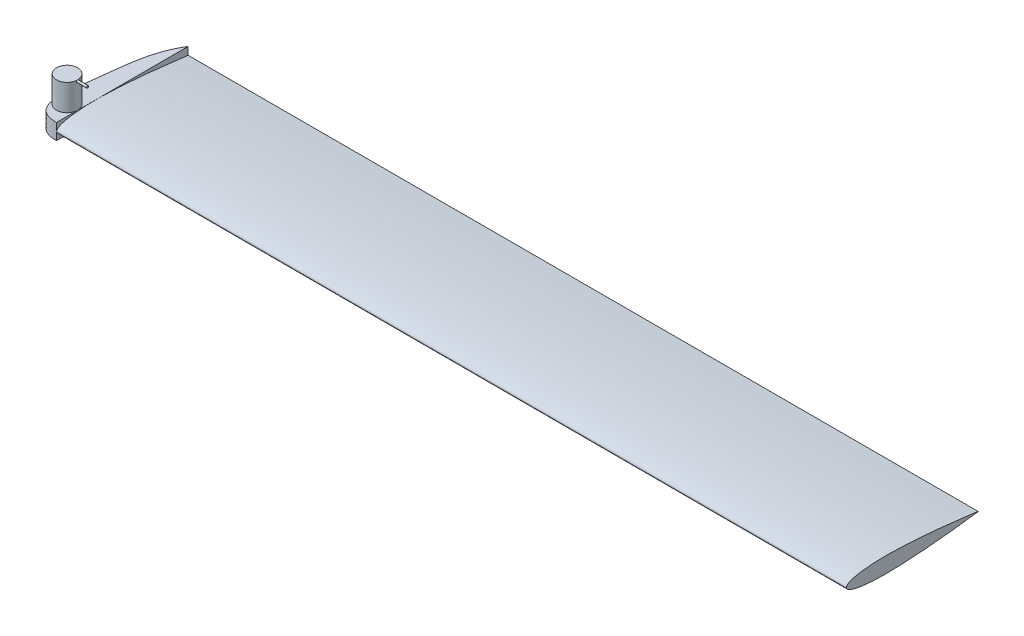
ISO-10303-21;
HEADER;
FILE_DESCRIPTION(('STEP AP214'),'2;1');
FILE_NAME('part.step','',(''),(''),'','','');
FILE_SCHEMA(('AUTOMOTIVE_DESIGN { 1 0 10303 214 1 1 1 1 }'));
ENDSEC;
DATA;
#1=APPLICATION_CONTEXT('core data for automotive mechanical design processes');
#2=APPLICATION_PROTOCOL_DEFINITION('international standard','automotive_design',2000,#1);
#3=PRODUCT_CONTEXT('',#1,'mechanical');
#4=PRODUCT('Part','Part','',(#3));
#5=PRODUCT_RELATED_PRODUCT_CATEGORY('part','',(#4));
#6=PRODUCT_DEFINITION_FORMATION('','',#4);
#7=PRODUCT_DEFINITION_CONTEXT('part definition',#1,'design');
#8=PRODUCT_DEFINITION('design','',#6,#7);
#9=PRODUCT_DEFINITION_SHAPE('','',#8);
#10=(LENGTH_UNIT() NAMED_UNIT(*) SI_UNIT(.MILLI.,.METRE.));
#11=(NAMED_UNIT(*) PLANE_ANGLE_UNIT() SI_UNIT($,.RADIAN.));
#12=(NAMED_UNIT(*) SI_UNIT($,.STERADIAN.) SOLID_ANGLE_UNIT());
#13=UNCERTAINTY_MEASURE_WITH_UNIT(LENGTH_MEASURE(1.E-05),#10,'distance_accuracy_value','');
#14=(GEOMETRIC_REPRESENTATION_CONTEXT(3) GLOBAL_UNCERTAINTY_ASSIGNED_CONTEXT((#13)) GLOBAL_UNIT_ASSIGNED_CONTEXT((#10,
#11,#12)) REPRESENTATION_CONTEXT('',''));
#15=CARTESIAN_POINT('',(0.,0.,0.));
#16=DIRECTION('',(0.,0.,1.));
#17=DIRECTION('',(1.,0.,0.));
#18=AXIS2_PLACEMENT_3D('',#15,#16,#17);
#19=CARTESIAN_POINT('',(-10.,40.,-20.));
#20=DIRECTION('',(0.,-1.,0.));
#21=DIRECTION('',(0.,0.,-1.));
#22=AXIS2_PLACEMENT_3D('',#19,#20,#21);
#23=CYLINDRICAL_SURFACE('',#22,10.);
#24=CARTESIAN_POINT('',(-10.,15.,-20.));
#25=DIRECTION('',(0.,1.,0.));
#26=DIRECTION('',(0.,0.,1.));
#27=AXIS2_PLACEMENT_3D('',#24,#25,#26);
#28=CIRCLE('',#27,10.);
#29=CARTESIAN_POINT('',(0.,15.,-20.));
#30=VERTEX_POINT('',#29);
#31=CARTESIAN_POINT('',(-20.,15.,-19.9998762848548));
#32=VERTEX_POINT('',#31);
#33=EDGE_CURVE('E118',#30,#32,#28,.T.);
#34=ORIENTED_EDGE('',*,*,#33,.T.);
#35=CARTESIAN_POINT('',(-19.9897549260361,15.,-19.5474555074506));
#36=CARTESIAN_POINT('',(-19.9960849752204,15.,-19.7723723018758));
#37=CARTESIAN_POINT('',(-20.,15.,-19.9998762848548));
#38=B_SPLINE_CURVE_WITH_KNOTS('',2,(#35,#36,#37),.UNSPECIFIED.,.F.,.F.,(3,3),(0.988813819343393,
1.),.UNSPECIFIED.);
#39=CARTESIAN_POINT('',(-19.9897549260361,15.,-19.5474555074504));
#40=VERTEX_POINT('',#39);
#41=EDGE_CURVE('E146',#40,#32,#38,.T.);
#42=ORIENTED_EDGE('',*,*,#41,.F.);
#43=EDGE_CURVE('E11',#40,#30,#28,.T.);
#44=ORIENTED_EDGE('',*,*,#43,.T.);
#45=EDGE_LOOP('',(#34,#42,#44));
#46=FACE_BOUND('',#45,.T.);
#47=CARTESIAN_POINT('',(-10.,40.,-20.));
#48=DIRECTION('',(0.,1.,0.));
#49=DIRECTION('',(0.,0.,1.));
#50=AXIS2_PLACEMENT_3D('',#47,#48,#49);
#51=CIRCLE('',#50,10.);
#52=CARTESIAN_POINT('',(1.13187796061662E-12,40.0000000000113,-19.9999999999987));
#53=VERTEX_POINT('',#52);
#54=EDGE_CURVE('E113',#53,#53,#51,.T.);
#55=ORIENTED_EDGE('',*,*,#54,.F.);
#56=CARTESIAN_POINT('',(-0.0501256289337938,39.,-21.));
#57=CARTESIAN_POINT('',(-0.0501249720309656,39.0560195641736,-20.9999975733935));
#58=CARTESIAN_POINT('',(-0.0496474300578126,39.1120761684118,-20.9952768589825));
#59=CARTESIAN_POINT('',(-0.0477891244188055,39.2226351862935,-20.9765163147636));
#60=CARTESIAN_POINT('',(-0.0464073653878035,39.2771358180375,-20.9624662148864));
#61=CARTESIAN_POINT('',(-0.0428986695261211,39.3829658192179,-20.9254601160689));
#62=CARTESIAN_POINT('',(-0.0407721845320974,39.4342970893914,-20.9025095162939));
#63=CARTESIAN_POINT('',(-0.0360141942817899,39.5323677922918,-20.8483642673911));
#64=CARTESIAN_POINT('',(-0.0333827893567047,39.5791081344837,-20.8171712556259));
#65=CARTESIAN_POINT('',(-0.0279007329010088,39.6668512636575,-20.7473047619987));
#66=CARTESIAN_POINT('',(-0.0250493999473345,39.7078350095038,-20.7086074181083));
#67=CARTESIAN_POINT('',(-0.0194549476428054,39.7827376090036,-20.6248817153196));
#68=CARTESIAN_POINT('',(-0.0167118332478645,39.8166561394063,-20.5798530669066));
#69=CARTESIAN_POINT('',(-0.0116361684439465,39.8765312570072,-20.484626361651));
#70=CARTESIAN_POINT('',(-0.00930449105352664,39.9024709987937,-20.4344176625296));
#71=CARTESIAN_POINT('',(-0.00532183124229081,39.9455444331487,-20.3303299842875));
#72=CARTESIAN_POINT('',(-0.00367083222935572,39.9626783403695,-20.2764510946682));
#73=CARTESIAN_POINT('',(-0.00124033428973593,39.9875979093533,-20.1667447827429));
#74=CARTESIAN_POINT('',(-0.000457921571828279,39.99541483275,-20.1109245270316));
#75=CARTESIAN_POINT('',(0.000157155986927986,40.0015752691337,-19.9987592593111));
#76=CARTESIAN_POINT('',(-1.0154547270365E-05,39.9999190277463,-19.9424142609455));
#77=CARTESIAN_POINT('',(-0.00127328688813979,39.9872055273498,-19.8310111559354));
#78=CARTESIAN_POINT('',(-0.00236578848286832,39.9761818844361,-19.775949170065));
#79=CARTESIAN_POINT('',(-0.00535270735069193,39.9450988710534,-19.6684608204955));
#80=CARTESIAN_POINT('',(-0.00724713504046194,39.9250393832124,-19.6160344910423));
#81=CARTESIAN_POINT('',(-0.0116306251608421,39.8764172367456,-19.5151996853204));
#82=CARTESIAN_POINT('',(-0.0141207263424196,39.8478397024698,-19.4667984290183));
#83=CARTESIAN_POINT('',(-0.0194161548059227,39.7830034766636,-19.3754664868258));
#84=CARTESIAN_POINT('',(-0.0222214913318851,39.7467445598548,-19.3325359614392));
#85=CARTESIAN_POINT('',(-0.0278470653214803,39.6673857704864,-19.2531672281773));
#86=CARTESIAN_POINT('',(-0.0306673142697202,39.6242566552584,-19.2167582538097));
#87=CARTESIAN_POINT('',(-0.0359926007177739,39.5324831347892,-19.1516924646421));
#88=CARTESIAN_POINT('',(-0.0384976377603528,39.4838387215479,-19.1230356610871));
#89=CARTESIAN_POINT('',(-0.0429091048585038,39.3823929748002,-19.0742878154268));
#90=CARTESIAN_POINT('',(-0.0448154086744516,39.3295907675771,-19.054198579427));
#91=CARTESIAN_POINT('',(-0.0478109812906195,39.2213393953853,-19.0231792643624));
#92=CARTESIAN_POINT('',(-0.0489002749823146,39.1658903111126,-19.012248906257));
#93=CARTESIAN_POINT('',(-0.0501341947258269,39.0541758204705,-18.999895224608));
#94=CARTESIAN_POINT('',(-0.0502828845239621,38.9979149797352,-18.9984310033528));
#95=CARTESIAN_POINT('',(-0.0496294864522824,38.8859487341771,-19.0049437531286));
#96=CARTESIAN_POINT('',(-0.0488274114293854,38.8302433218596,-19.0129205965902));
#97=CARTESIAN_POINT('',(-0.046366555775981,38.7210884177217,-19.0380548254925));
#98=CARTESIAN_POINT('',(-0.0447095799865423,38.6676344289053,-19.0551928728111));
#99=CARTESIAN_POINT('',(-0.0407270896120501,38.5643599482697,-19.0981432803241));
#100=CARTESIAN_POINT('',(-0.0384015597133008,38.5145395397128,-19.1239558392164));
#101=CARTESIAN_POINT('',(-0.03333415644286,38.4197600259712,-19.1836249985768));
#102=CARTESIAN_POINT('',(-0.0305908918532786,38.3748180580337,-19.2175087001593));
#103=CARTESIAN_POINT('',(-0.0250016737481343,38.2912449467259,-19.2923194665488));
#104=CARTESIAN_POINT('',(-0.0221557176913383,38.2526139596599,-19.3332467057519));
#105=CARTESIAN_POINT('',(-0.0166695215069793,38.1826183666019,-19.4211601957735));
#106=CARTESIAN_POINT('',(-0.0140300594452521,38.1512804404138,-19.4681677440305));
#107=CARTESIAN_POINT('',(-0.00926557893369075,38.0969441314936,-19.5668022825829));
#108=CARTESIAN_POINT('',(-0.00714055343507039,38.0739456344929,-19.6184292095704));
#109=CARTESIAN_POINT('',(-0.00364789585993858,38.0369862323447,-19.7247438735672));
#110=CARTESIAN_POINT('',(-0.00227891394350912,38.0230092126748,-19.77942596235));
#111=CARTESIAN_POINT('',(-0.000447053863505604,38.0044369304202,-19.8903751860163));
#112=CARTESIAN_POINT('',(1.58497656318219E-05,37.999841404166,-19.9466422763078));
#113=CARTESIAN_POINT('',(-1.66168673006057E-05,38.0001662664399,-20.0589022240757));
#114=CARTESIAN_POINT('',(-0.000507816233299473,38.0050452368367,-20.1148952072245));
#115=CARTESIAN_POINT('',(-0.00238506422408484,38.024093745657,-20.2252618883564));
#116=CARTESIAN_POINT('',(-0.00377111355125988,38.038263291373,-20.2796355850684));
#117=CARTESIAN_POINT('',(-0.00728276186037914,38.0754792573929,-20.3852199087677));
#118=CARTESIAN_POINT('',(-0.00940825996750611,38.0985244669342,-20.4364309660775));
#119=CARTESIAN_POINT('',(-0.0141618758370373,38.152833168917,-20.5342646001548));
#120=CARTESIAN_POINT('',(-0.0167899906584497,38.1840966132711,-20.5808872037686));
#121=CARTESIAN_POINT('',(-0.0222681533094454,38.2541096190237,-20.6684327244269));
#122=CARTESIAN_POINT('',(-0.0251190853930031,38.2928900162448,-20.7093309262193));
#123=CARTESIAN_POINT('',(-0.0307140923034101,38.3767753515454,-20.7840577593931));
#124=CARTESIAN_POINT('',(-0.0334581413222268,38.4218818051691,-20.8178846918478));
#125=CARTESIAN_POINT('',(-0.0385361658939872,38.5172643419199,-20.877576640424));
#126=CARTESIAN_POINT('',(-0.0408690807469323,38.567553281324,-20.9034211879948));
#127=CARTESIAN_POINT('',(-0.0448480523753764,38.6717482912462,-20.9462647080988));
#128=CARTESIAN_POINT('',(-0.0464948834664039,38.7256502039257,-20.9632736578899));
#129=CARTESIAN_POINT('',(-0.0484999246185461,38.8165477408991,-20.9837216883335));
#130=CARTESIAN_POINT('',(-0.0491066806430541,38.8529622513064,-20.9898177123982));
#131=CARTESIAN_POINT('',(-0.0499197482233616,38.9262458230426,-20.9979576586051));
#132=CARTESIAN_POINT('',(-0.050126061460151,38.9631148824626,-21.0000015977573));
#133=CARTESIAN_POINT('',(-0.0501256289337938,39.,-21.));
#134=B_SPLINE_CURVE_WITH_KNOTS('',3,(#56,#57,#58,#59,#60,#61,#62,#63,#64,#65,#66,#67,#68,#69,
#70,#71,#72,#73,#74,#75,#76,#77,#78,#79,#80,#81,#82,#83,#84,#85,#86,#87,#88,#89,#90,#91,#92,#93,
#94,#95,#96,#97,#98,#99,#100,#101,#102,#103,#104,#105,#106,#107,#108,#109,#110,#111,#112,#113,
#114,#115,#116,#117,#118,#119,#120,#121,#122,#123,#124,#125,#126,#127,#128,#129,#130,#131,#132,
#133),.UNSPECIFIED.,.T.,.F.,(4,2,2,2,2,2,2,2,2,2,2,2,2,2,2,2,2,2,2,2,2,2,2,2,2,2,2,2,2,2,2,2,2,
2,2,2,2,2,4),(0.,0.167923994436456,0.33603315182177,0.504040490997475,0.672014480421315,
0.840531615299244,1.00905645855253,1.17793469971292,1.34680882407795,1.5151147089845,
1.68341622998233,1.85111631818662,2.01881858480975,2.18681545466414,2.3548172521853,
2.52355425085001,2.69229149427563,2.86106429117934,3.02983194595034,3.19786996307765,
3.36590570966871,3.53358814704528,3.70127442561049,3.86953189811719,4.03779353723203,
4.20666136818119,4.37552688518006,4.54408992694362,4.7126482311315,4.88047133468484,
5.04829456996659,5.21609491995248,5.383894288108,5.5523971503799,5.72094045034525,
5.88991241070476,6.05869314894002,6.16926027606048,6.27982693903816),.UNSPECIFIED.);
#135=EDGE_CURVE('E115',#53,#53,#134,.T.);
#136=ORIENTED_EDGE('',*,*,#135,.F.);
#137=EDGE_LOOP('',(#55,#136));
#138=FACE_BOUND('',#137,.T.);
#139=ADVANCED_FACE('F41',(#46,#138),#23,.T.);
#140=CARTESIAN_POINT('',(0.,15.,0.));
#141=DIRECTION('',(0.,1.,0.));
#142=DIRECTION('',(0.,0.,1.));
#143=AXIS2_PLACEMENT_3D('',#140,#141,#142);
#144=PLANE('',#143);
#145=ORIENTED_EDGE('',*,*,#33,.F.);
#146=DIRECTION('',(0.,0.,1.));
#147=VECTOR('',#146,1.);
#148=CARTESIAN_POINT('',(0.,15.,0.));
#149=LINE('',#148,#147);
#150=CARTESIAN_POINT('',(0.,15.,-124.995841148639));
#151=VERTEX_POINT('',#150);
#152=EDGE_CURVE('E155',#151,#30,#149,.T.);
#153=ORIENTED_EDGE('',*,*,#152,.F.);
#154=CARTESIAN_POINT('',(-20.,15.,-19.9998762848548));
#155=CARTESIAN_POINT('',(-20.2564912211701,15.,-33.6052371083741));
#156=CARTESIAN_POINT('',(-15.1417465608003,15.,-69.2209750979922));
#157=CARTESIAN_POINT('',(-12.6666720212341,15.,-105.011543661617));
#158=CARTESIAN_POINT('',(0.,15.,-124.995841148639));
#159=B_SPLINE_CURVE_WITH_KNOTS('',3,(#154,#155,#156,#157,#158),.UNSPECIFIED.,.F.,.F.,(4,1,4),
(0.,0.363918554591473,1.),.UNSPECIFIED.);
#160=EDGE_CURVE('E46',#32,#151,#159,.T.);
#161=ORIENTED_EDGE('',*,*,#160,.F.);
#162=EDGE_LOOP('',(#145,#153,#161));
#163=FACE_BOUND('',#162,.T.);
#164=ADVANCED_FACE('F178',(#163),#144,.T.);
#165=CARTESIAN_POINT('',(750.,7.69748541026481,-124.995841148639));
#166=CARTESIAN_POINT('',(750.,8.13297079806969,-121.549441339967));
#167=CARTESIAN_POINT('',(750.,8.8711094317515,-115.707865670304));
#168=CARTESIAN_POINT('',(750.,10.001168495884,-106.612829462784));
#169=CARTESIAN_POINT('',(750.,10.900080960327,-98.7766774485687));
#170=CARTESIAN_POINT('',(750.,11.7180797430692,-91.0104309827742));
#171=CARTESIAN_POINT('',(750.,12.374421583348,-84.4661711660079));
#172=CARTESIAN_POINT('',(750.,13.0108919100097,-77.1231270334049));
#173=CARTESIAN_POINT('',(750.,13.6615586610674,-70.096902966347));
#174=CARTESIAN_POINT('',(750.,14.0382624320619,-63.2321869691896));
#175=CARTESIAN_POINT('',(750.,14.4586464854716,-56.9511833567442));
#176=CARTESIAN_POINT('',(750.,14.7447792836539,-50.1830543119707));
#177=CARTESIAN_POINT('',(750.,14.9288477277546,-43.7131494322692));
#178=CARTESIAN_POINT('',(750.,14.9867694495661,-38.0167473663419));
#179=CARTESIAN_POINT('',(750.,14.9641673572682,-31.8671085177231));
#180=CARTESIAN_POINT('',(750.,14.7641718889759,-25.9611084011886));
#181=CARTESIAN_POINT('',(750.,14.3189228100668,-20.4184783683121));
#182=CARTESIAN_POINT('',(750.,13.9020772787466,-16.0808939192611));
#183=CARTESIAN_POINT('',(750.,13.2766805127196,-11.948417440773));
#184=CARTESIAN_POINT('',(750.,12.4387478677314,-7.87202213430819));
#185=CARTESIAN_POINT('',(750.,11.4815907628938,-4.55145990959005));
#186=CARTESIAN_POINT('',(750.,10.1896156908138,-1.93507828303653));
#187=CARTESIAN_POINT('',(750.,8.86775259773538,-0.419790589282026));
#188=CARTESIAN_POINT('',(750.,7.67644804525767,0.11632820232294));
#189=CARTESIAN_POINT('',(750.,6.57571630783656,-0.228543288672665));
#190=CARTESIAN_POINT('',(750.,5.38282804272362,-1.09205976929891));
#191=CARTESIAN_POINT('',(750.,4.18267580665148,-3.12132983163146));
#192=CARTESIAN_POINT('',(750.,3.12236016112023,-5.83394586751756));
#193=CARTESIAN_POINT('',(750.,2.33803973933592,-8.96942484585597));
#194=CARTESIAN_POINT('',(750.,1.63555506566896,-12.4549344479186));
#195=CARTESIAN_POINT('',(750.,1.0576222452614,-16.3980412905516));
#196=CARTESIAN_POINT('',(750.,0.619305341649041,-20.4073734698152));
#197=CARTESIAN_POINT('',(750.,0.31851410484638,-24.9404968445985));
#198=CARTESIAN_POINT('',(750.,0.0979146932351296,-28.9969109003526));
#199=CARTESIAN_POINT('',(750.,0.0649508194327663,-33.6403576750407));
#200=CARTESIAN_POINT('',(750.,-0.00877400175199696,-37.6198248379226));
#201=CARTESIAN_POINT('',(750.,0.015166900275881,-42.1302311610639));
#202=CARTESIAN_POINT('',(750.,0.12809961974748,-46.8254786090486));
#203=CARTESIAN_POINT('',(750.,0.308197082911385,-52.0592292594811));
#204=CARTESIAN_POINT('',(750.,0.566048003035137,-57.5702731705481));
#205=CARTESIAN_POINT('',(750.,0.903534980744857,-63.0665569396856));
#206=CARTESIAN_POINT('',(750.,1.27356010427155,-68.7815874397308));
#207=CARTESIAN_POINT('',(750.,1.70119585281695,-74.2410513997578));
#208=CARTESIAN_POINT('',(750.,2.13196813018693,-79.3320789909935));
#209=CARTESIAN_POINT('',(750.,2.52583779535599,-83.7651352480584));
#210=CARTESIAN_POINT('',(750.,3.01497217512738,-88.3338625479964));
#211=CARTESIAN_POINT('',(750.,3.49549121200945,-93.4518819084549));
#212=CARTESIAN_POINT('',(750.,4.03066318219639,-98.4485149275409));
#213=CARTESIAN_POINT('',(750.,4.55967089304909,-103.359945305802));
#214=CARTESIAN_POINT('',(750.,5.05105140142525,-107.534749069242));
#215=CARTESIAN_POINT('',(750.,5.65258932830013,-112.036034411145));
#216=CARTESIAN_POINT('',(750.,6.20511451438241,-116.898948087647));
#217=CARTESIAN_POINT('',(750.,6.89818955039857,-121.185254011004));
#218=CARTESIAN_POINT('',(750.,7.13557750543474,-124.034905271131));
#219=CARTESIAN_POINT('',(750.,7.32673022277285,-124.871587069256));
#220=CARTESIAN_POINT('',(750.,7.3551179622547,-124.995841148639));
#221=B_SPLINE_CURVE_WITH_KNOTS('',3,(#165,#166,#167,#168,#169,#170,#171,#172,#173,#174,#175,
#176,#177,#178,#179,#180,#181,#182,#183,#184,#185,#186,#187,#188,#189,#190,#191,#192,#193,#194,
#195,#196,#197,#198,#199,#200,#201,#202,#203,#204,#205,#206,#207,#208,#209,#210,#211,#212,#213,
#214,#215,#216,#217,#218,#219,#220),.UNSPECIFIED.,.F.,.F.,(4,1,1,1,1,1,1,1,1,1,1,1,1,1,1,1,1,1,
1,1,1,1,1,1,1,1,1,1,1,1,1,1,1,1,1,1,1,1,1,1,1,1,1,1,1,1,1,1,1,1,1,1,1,4),(0.,0.0409096927672382,
0.069341074509443,0.107932085318759,0.13379571453232,0.16130729717174,0.185385503767664,
0.220597865919934,0.244393633444343,0.266343568343719,0.294730889223809,0.324163187557855,
0.342565083334242,0.361815516183744,0.396586444452688,0.412117027739434,0.427295280855564,
0.447896389869057,0.461301180767998,0.476284913180007,0.488528162874039,0.495261637278021,
0.499815716845931,0.502760784822896,0.508369898484513,0.516837025917484,0.529992214815813,
0.542688858921217,0.554812189598935,0.571870003296213,0.589595673628932,0.602296180079901,
0.625369139144534,0.637420540621771,0.656976539844779,0.672241266584835,0.690533980122457,
0.712285020909276,0.733912637938034,0.755503976489473,0.777133728985755,0.801356586058894,
0.819993044264083,0.837303590830548,0.853766864034959,0.874103184409616,0.897840615251757,
0.912945775380075,0.93227821936547,0.947341946687704,0.966428855971776,0.989896212666448,
0.998499505073226,1.),.UNSPECIFIED.);
#222=DIRECTION('',(-1.,0.,0.));
#223=VECTOR('',#222,1.);
#224=SURFACE_OF_LINEAR_EXTRUSION('',#221,#223);
#225=CARTESIAN_POINT('',(0.,7.69748541026481,-124.995841148639));
#226=CARTESIAN_POINT('',(0.,8.13297079806969,-121.549441339967));
#227=CARTESIAN_POINT('',(0.,8.8711094317515,-115.707865670304));
#228=CARTESIAN_POINT('',(0.,10.001168495884,-106.612829462784));
#229=CARTESIAN_POINT('',(0.,10.900080960327,-98.7766774485687));
#230=CARTESIAN_POINT('',(0.,11.7180797430692,-91.0104309827742));
#231=CARTESIAN_POINT('',(0.,12.374421583348,-84.4661711660079));
#232=CARTESIAN_POINT('',(0.,13.0108919100097,-77.1231270334049));
#233=CARTESIAN_POINT('',(0.,13.6615586610674,-70.096902966347));
#234=CARTESIAN_POINT('',(0.,14.0382624320619,-63.2321869691896));
#235=CARTESIAN_POINT('',(0.,14.4586464854716,-56.9511833567442));
#236=CARTESIAN_POINT('',(0.,14.7447792836539,-50.1830543119707));
#237=CARTESIAN_POINT('',(0.,14.9288477277546,-43.7131494322692));
#238=CARTESIAN_POINT('',(0.,14.9867694495661,-38.0167473663419));
#239=CARTESIAN_POINT('',(0.,14.9641673572682,-31.8671085177231));
#240=CARTESIAN_POINT('',(0.,14.7641718889759,-25.9611084011886));
#241=CARTESIAN_POINT('',(0.,14.3189228100668,-20.4184783683121));
#242=CARTESIAN_POINT('',(0.,13.9020772787466,-16.0808939192611));
#243=CARTESIAN_POINT('',(0.,13.2766805127196,-11.948417440773));
#244=CARTESIAN_POINT('',(0.,12.4387478677314,-7.87202213430819));
#245=CARTESIAN_POINT('',(0.,11.4815907628938,-4.55145990959005));
#246=CARTESIAN_POINT('',(0.,10.1896156908138,-1.93507828303653));
#247=CARTESIAN_POINT('',(0.,8.86775259773538,-0.419790589282026));
#248=CARTESIAN_POINT('',(0.,7.67644804525767,0.11632820232294));
#249=CARTESIAN_POINT('',(0.,6.57571630783656,-0.228543288672665));
#250=CARTESIAN_POINT('',(0.,5.38282804272362,-1.09205976929891));
#251=CARTESIAN_POINT('',(0.,4.18267580665148,-3.12132983163146));
#252=CARTESIAN_POINT('',(0.,3.12236016112023,-5.83394586751756));
#253=CARTESIAN_POINT('',(0.,2.33803973933592,-8.96942484585597));
#254=CARTESIAN_POINT('',(0.,1.63555506566896,-12.4549344479186));
#255=CARTESIAN_POINT('',(0.,1.0576222452614,-16.3980412905516));
#256=CARTESIAN_POINT('',(0.,0.619305341649041,-20.4073734698152));
#257=CARTESIAN_POINT('',(0.,0.31851410484638,-24.9404968445985));
#258=CARTESIAN_POINT('',(0.,0.0979146932351296,-28.9969109003526));
#259=CARTESIAN_POINT('',(0.,0.0649508194327663,-33.6403576750407));
#260=CARTESIAN_POINT('',(0.,-0.00877400175199696,-37.6198248379226));
#261=CARTESIAN_POINT('',(0.,0.015166900275881,-42.1302311610639));
#262=CARTESIAN_POINT('',(0.,0.12809961974748,-46.8254786090486));
#263=CARTESIAN_POINT('',(0.,0.308197082911385,-52.0592292594811));
#264=CARTESIAN_POINT('',(0.,0.566048003035137,-57.5702731705481));
#265=CARTESIAN_POINT('',(0.,0.903534980744857,-63.0665569396856));
#266=CARTESIAN_POINT('',(0.,1.27356010427155,-68.7815874397308));
#267=CARTESIAN_POINT('',(0.,1.70119585281695,-74.2410513997578));
#268=CARTESIAN_POINT('',(0.,2.13196813018693,-79.3320789909935));
#269=CARTESIAN_POINT('',(0.,2.52583779535599,-83.7651352480584));
#270=CARTESIAN_POINT('',(0.,3.01497217512738,-88.3338625479964));
#271=CARTESIAN_POINT('',(0.,3.49549121200945,-93.4518819084549));
#272=CARTESIAN_POINT('',(0.,4.03066318219639,-98.4485149275409));
#273=CARTESIAN_POINT('',(0.,4.55967089304909,-103.359945305802));
#274=CARTESIAN_POINT('',(0.,5.05105140142525,-107.534749069242));
#275=CARTESIAN_POINT('',(0.,5.65258932830013,-112.036034411145));
#276=CARTESIAN_POINT('',(0.,6.20511451438241,-116.898948087647));
#277=CARTESIAN_POINT('',(0.,6.89818955039857,-121.185254011004));
#278=CARTESIAN_POINT('',(0.,7.13557750543474,-124.034905271131));
#279=CARTESIAN_POINT('',(0.,7.32673022277285,-124.871587069256));
#280=CARTESIAN_POINT('',(0.,7.3551179622547,-124.995841148639));
#281=B_SPLINE_CURVE_WITH_KNOTS('',3,(#225,#226,#227,#228,#229,#230,#231,#232,#233,#234,#235,
#236,#237,#238,#239,#240,#241,#242,#243,#244,#245,#246,#247,#248,#249,#250,#251,#252,#253,#254,
#255,#256,#257,#258,#259,#260,#261,#262,#263,#264,#265,#266,#267,#268,#269,#270,#271,#272,#273,
#274,#275,#276,#277,#278,#279,#280),.UNSPECIFIED.,.F.,.F.,(4,1,1,1,1,1,1,1,1,1,1,1,1,1,1,1,1,1,
1,1,1,1,1,1,1,1,1,1,1,1,1,1,1,1,1,1,1,1,1,1,1,1,1,1,1,1,1,1,1,1,1,1,1,4),(0.,0.0409096927672382,
0.069341074509443,0.107932085318759,0.13379571453232,0.16130729717174,0.185385503767664,
0.220597865919934,0.244393633444343,0.266343568343719,0.294730889223809,0.324163187557855,
0.342565083334242,0.361815516183744,0.396586444452688,0.412117027739434,0.427295280855564,
0.447896389869057,0.461301180767998,0.476284913180007,0.488528162874039,0.495261637278021,
0.499815716845931,0.502760784822896,0.508369898484513,0.516837025917484,0.529992214815813,
0.542688858921217,0.554812189598935,0.571870003296213,0.589595673628932,0.602296180079901,
0.625369139144534,0.637420540621771,0.656976539844779,0.672241266584835,0.690533980122457,
0.712285020909276,0.733912637938034,0.755503976489473,0.777133728985755,0.801356586058894,
0.819993044264083,0.837303590830548,0.853766864034959,0.874103184409616,0.897840615251757,
0.912945775380075,0.93227821936547,0.947341946687704,0.966428855971776,0.989896212666448,
0.998499505073226,1.),.UNSPECIFIED.);
#282=CARTESIAN_POINT('',(0.,7.69748541026481,-124.995841148639));
#283=VERTEX_POINT('',#282);
#284=CARTESIAN_POINT('',(0.,7.55858231577554,0.000123715145150439));
#285=VERTEX_POINT('',#284);
#286=EDGE_CURVE('E238',#283,#285,#281,.T.);
#287=ORIENTED_EDGE('',*,*,#286,.T.);
#288=CARTESIAN_POINT('',(0.,7.3551179622547,-124.995841148639));
#289=VERTEX_POINT('',#288);
#290=EDGE_CURVE('E85',#285,#289,#281,.T.);
#291=ORIENTED_EDGE('',*,*,#290,.T.);
#292=DIRECTION('',(-1.,0.,0.));
#293=VECTOR('',#292,1.);
#294=CARTESIAN_POINT('',(750.,7.3551179622547,-124.995841148639));
#295=LINE('',#294,#293);
#296=CARTESIAN_POINT('',(750.,7.3551179622547,-124.995841148639));
#297=VERTEX_POINT('',#296);
#298=EDGE_CURVE('E52',#297,#289,#295,.T.);
#299=ORIENTED_EDGE('',*,*,#298,.F.);
#300=CARTESIAN_POINT('',(750.,7.69748541026481,-124.995841148639));
#301=VERTEX_POINT('',#300);
#302=EDGE_CURVE('E227',#301,#297,#221,.T.);
#303=ORIENTED_EDGE('',*,*,#302,.F.);
#304=DIRECTION('',(-1.,0.,0.));
#305=VECTOR('',#304,1.);
#306=CARTESIAN_POINT('',(750.,7.69748541026481,-124.995841148639));
#307=LINE('',#306,#305);
#308=EDGE_CURVE('E237',#301,#283,#307,.T.);
#309=ORIENTED_EDGE('',*,*,#308,.T.);
#310=EDGE_LOOP('',(#287,#291,#299,#303,#309));
#311=FACE_BOUND('',#310,.T.);
#312=ADVANCED_FACE('F43',(#311),#224,.F.);
#313=CARTESIAN_POINT('',(750.,7.69748541026481,-124.995841148639));
#314=DIRECTION('',(0.,0.,1.));
#315=DIRECTION('',(1.,0.,0.));
#316=AXIS2_PLACEMENT_3D('',#313,#314,#315);
#317=PLANE('',#316);
#318=DIRECTION('',(0.,1.,0.));
#319=VECTOR('',#318,1.);
#320=CARTESIAN_POINT('',(0.,7.69748541026481,-124.995841148639));
#321=LINE('',#320,#319);
#322=EDGE_CURVE('E232',#289,#283,#321,.T.);
#323=ORIENTED_EDGE('',*,*,#322,.T.);
#324=ORIENTED_EDGE('',*,*,#308,.F.);
#325=DIRECTION('',(0.,1.,0.));
#326=VECTOR('',#325,1.);
#327=CARTESIAN_POINT('',(750.,7.69748541026481,-124.995841148639));
#328=LINE('',#327,#326);
#329=EDGE_CURVE('E66',#297,#301,#328,.T.);
#330=ORIENTED_EDGE('',*,*,#329,.F.);
#331=ORIENTED_EDGE('',*,*,#298,.T.);
#332=EDGE_LOOP('',(#323,#324,#330,#331));
#333=FACE_BOUND('',#332,.T.);
#334=ADVANCED_FACE('F172',(#333),#317,.F.);
#335=CARTESIAN_POINT('',(750.,7.49465768006498,-0.00151174548001802));
#336=DIRECTION('',(-1.,0.,0.));
#337=DIRECTION('',(0.,0.,1.));
#338=AXIS2_PLACEMENT_3D('',#335,#336,#337);
#339=PLANE('',#338);
#340=ORIENTED_EDGE('',*,*,#302,.T.);
#341=ORIENTED_EDGE('',*,*,#329,.T.);
#342=EDGE_LOOP('',(#340,#341));
#343=FACE_BOUND('',#342,.T.);
#344=ADVANCED_FACE('F170',(#343),#339,.F.);
#345=CARTESIAN_POINT('',(0.,15.,0.));
#346=DIRECTION('',(1.,0.,0.));
#347=DIRECTION('',(0.,0.,-1.));
#348=AXIS2_PLACEMENT_3D('',#345,#346,#347);
#349=PLANE('',#348);
#350=ORIENTED_EDGE('',*,*,#286,.F.);
#351=DIRECTION('',(0.,-1.,0.));
#352=VECTOR('',#351,1.);
#353=CARTESIAN_POINT('',(0.,15.,-124.995841148639));
#354=LINE('',#353,#352);
#355=EDGE_CURVE('E77',#151,#283,#354,.T.);
#356=ORIENTED_EDGE('',*,*,#355,.F.);
#357=ORIENTED_EDGE('',*,*,#152,.T.);
#358=CARTESIAN_POINT('',(0.,15.,0.000123715145150439));
#359=VERTEX_POINT('',#358);
#360=EDGE_CURVE('E145',#30,#359,#149,.T.);
#361=ORIENTED_EDGE('',*,*,#360,.T.);
#362=DIRECTION('',(0.,-1.,0.));
#363=VECTOR('',#362,1.);
#364=CARTESIAN_POINT('',(0.,15.,0.000123715145150439));
#365=LINE('',#364,#363);
#366=EDGE_CURVE('E225',#359,#285,#365,.T.);
#367=ORIENTED_EDGE('',*,*,#366,.T.);
#368=EDGE_LOOP('',(#350,#356,#357,#361,#367));
#369=FACE_BOUND('',#368,.T.);
#370=ADVANCED_FACE('F168',(#369),#349,.T.);
#371=ORIENTED_EDGE('',*,*,#290,.F.);
#372=CARTESIAN_POINT('',(0.,0.,0.000123715145150439));
#373=VERTEX_POINT('',#372);
#374=EDGE_CURVE('E223',#285,#373,#365,.T.);
#375=ORIENTED_EDGE('',*,*,#374,.T.);
#376=DIRECTION('',(0.,0.,1.));
#377=VECTOR('',#376,1.);
#378=CARTESIAN_POINT('',(0.,0.,0.));
#379=LINE('',#378,#377);
#380=CARTESIAN_POINT('',(0.,0.,-124.995841148639));
#381=VERTEX_POINT('',#380);
#382=EDGE_CURVE('E121',#381,#373,#379,.T.);
#383=ORIENTED_EDGE('',*,*,#382,.F.);
#384=EDGE_CURVE('E224',#289,#381,#354,.T.);
#385=ORIENTED_EDGE('',*,*,#384,.F.);
#386=EDGE_LOOP('',(#371,#375,#383,#385));
#387=FACE_BOUND('',#386,.T.);
#388=ADVANCED_FACE('F166',(#387),#349,.T.);
#389=CARTESIAN_POINT('',(0.,15.,0.000123715145150439));
#390=CARTESIAN_POINT('',(-19.6500123769003,15.,0.338073723545331));
#391=CARTESIAN_POINT('',(-20.,15.,-19.9998762848548));
#392=B_SPLINE_CURVE_WITH_KNOTS('',2,(#389,#390,#391),.UNSPECIFIED.,.F.,.F.,(3,3),(0.,1.),.UNSPECIFIED.);
#393=DIRECTION('',(0.,-1.,0.));
#394=VECTOR('',#393,1.);
#395=SURFACE_OF_LINEAR_EXTRUSION('',#392,#394);
#396=CARTESIAN_POINT('',(0.,0.,0.000123715145150439));
#397=CARTESIAN_POINT('',(-19.6500123769003,0.,0.338073723545331));
#398=CARTESIAN_POINT('',(-20.,0.,-19.9998762848548));
#399=B_SPLINE_CURVE_WITH_KNOTS('',2,(#396,#397,#398),.UNSPECIFIED.,.F.,.F.,(3,3),(0.,1.),.UNSPECIFIED.);
#400=CARTESIAN_POINT('',(-20.,0.,-19.9998762848548));
#401=VERTEX_POINT('',#400);
#402=EDGE_CURVE('E117',#373,#401,#399,.T.);
#403=ORIENTED_EDGE('',*,*,#402,.F.);
#404=ORIENTED_EDGE('',*,*,#374,.F.);
#405=ORIENTED_EDGE('',*,*,#366,.F.);
#406=EDGE_CURVE('E142',#359,#40,#392,.T.);
#407=ORIENTED_EDGE('',*,*,#406,.T.);
#408=ORIENTED_EDGE('',*,*,#41,.T.);
#409=DIRECTION('',(0.,-1.,0.));
#410=VECTOR('',#409,1.);
#411=CARTESIAN_POINT('',(-20.,15.,-19.9998762848548));
#412=LINE('',#411,#410);
#413=EDGE_CURVE('E147',#32,#401,#412,.T.);
#414=ORIENTED_EDGE('',*,*,#413,.T.);
#415=EDGE_LOOP('',(#403,#404,#405,#407,#408,#414));
#416=FACE_BOUND('',#415,.T.);
#417=ADVANCED_FACE('F160',(#416),#395,.T.);
#418=DIRECTION('',(0.,-1.,0.));
#419=VECTOR('',#418,1.);
#420=SURFACE_OF_LINEAR_EXTRUSION('',#159,#419);
#421=CARTESIAN_POINT('',(-20.,0.,-19.9998762848548));
#422=CARTESIAN_POINT('',(-20.2564912211701,0.,-33.6052371083741));
#423=CARTESIAN_POINT('',(-15.1417465608003,0.,-69.2209750979922));
#424=CARTESIAN_POINT('',(-12.6666720212341,0.,-105.011543661617));
#425=CARTESIAN_POINT('',(0.,0.,-124.995841148639));
#426=B_SPLINE_CURVE_WITH_KNOTS('',3,(#421,#422,#423,#424,#425),.UNSPECIFIED.,.F.,.F.,(4,1,4),
(0.,0.363918554591473,1.),.UNSPECIFIED.);
#427=EDGE_CURVE('E214',#401,#381,#426,.T.);
#428=ORIENTED_EDGE('',*,*,#427,.F.);
#429=ORIENTED_EDGE('',*,*,#413,.F.);
#430=ORIENTED_EDGE('',*,*,#160,.T.);
#431=ORIENTED_EDGE('',*,*,#355,.T.);
#432=ORIENTED_EDGE('',*,*,#322,.F.);
#433=ORIENTED_EDGE('',*,*,#384,.T.);
#434=EDGE_LOOP('',(#428,#429,#430,#431,#432,#433));
#435=FACE_BOUND('',#434,.T.);
#436=ADVANCED_FACE('F165',(#435),#420,.T.);
#437=ORIENTED_EDGE('',*,*,#43,.F.);
#438=ORIENTED_EDGE('',*,*,#406,.F.);
#439=ORIENTED_EDGE('',*,*,#360,.F.);
#440=EDGE_LOOP('',(#437,#438,#439));
#441=FACE_BOUND('',#440,.T.);
#442=ADVANCED_FACE('F188',(#441),#144,.T.);
#443=CARTESIAN_POINT('',(0.,0.,0.));
#444=DIRECTION('',(0.,1.,0.));
#445=DIRECTION('',(0.,0.,1.));
#446=AXIS2_PLACEMENT_3D('',#443,#444,#445);
#447=PLANE('',#446);
#448=ORIENTED_EDGE('',*,*,#402,.T.);
#449=ORIENTED_EDGE('',*,*,#427,.T.);
#450=ORIENTED_EDGE('',*,*,#382,.T.);
#451=EDGE_LOOP('',(#448,#449,#450));
#452=FACE_BOUND('',#451,.T.);
#453=ADVANCED_FACE('F195',(#452),#447,.F.);
#454=CARTESIAN_POINT('',(-10.,40.,-20.));
#455=DIRECTION('',(0.,1.,0.));
#456=DIRECTION('',(0.,0.,1.));
#457=AXIS2_PLACEMENT_3D('',#454,#455,#456);
#458=PLANE('',#457);
#459=ORIENTED_EDGE('',*,*,#54,.T.);
#460=EDGE_LOOP('',(#459));
#461=FACE_BOUND('',#460,.T.);
#462=ADVANCED_FACE('F191',(#461),#458,.T.);
#463=CARTESIAN_POINT('',(9.5,39.,-20.));
#464=DIRECTION('',(-1.,0.,0.));
#465=DIRECTION('',(0.,0.,1.));
#466=AXIS2_PLACEMENT_3D('',#463,#464,#465);
#467=CYLINDRICAL_SURFACE('',#466,1.);
#468=CARTESIAN_POINT('',(9.5,39.,-20.));
#469=DIRECTION('',(1.,0.,0.));
#470=DIRECTION('',(0.,0.,-1.));
#471=AXIS2_PLACEMENT_3D('',#468,#469,#470);
#472=CIRCLE('',#471,1.);
#473=CARTESIAN_POINT('',(9.5,39.,-21.));
#474=VERTEX_POINT('',#473);
#475=EDGE_CURVE('E124',#474,#474,#472,.T.);
#476=ORIENTED_EDGE('',*,*,#475,.F.);
#477=EDGE_LOOP('',(#476));
#478=FACE_BOUND('',#477,.T.);
#479=ORIENTED_EDGE('',*,*,#135,.T.);
#480=EDGE_LOOP('',(#479));
#481=FACE_BOUND('',#480,.T.);
#482=ADVANCED_FACE('F312',(#478,#481),#467,.T.);
#483=CARTESIAN_POINT('',(9.5,39.,-20.));
#484=DIRECTION('',(1.,0.,0.));
#485=DIRECTION('',(0.,0.,-1.));
#486=AXIS2_PLACEMENT_3D('',#483,#484,#485);
#487=PLANE('',#486);
#488=ORIENTED_EDGE('',*,*,#475,.T.);
#489=EDGE_LOOP('',(#488));
#490=FACE_BOUND('',#489,.T.);
#491=ADVANCED_FACE('F324',(#490),#487,.T.);
#492=CLOSED_SHELL('',(#139,#164,#312,#334,#344,#370,#388,#417,#436,#442,#453,#462,#482,#491));
#493=MANIFOLD_SOLID_BREP('B2',#492);
#494=ADVANCED_BREP_SHAPE_REPRESENTATION('',(#18,#493),#14);
#495=SHAPE_DEFINITION_REPRESENTATION(#9,#494);
ENDSEC;
END-ISO-10303-21;
